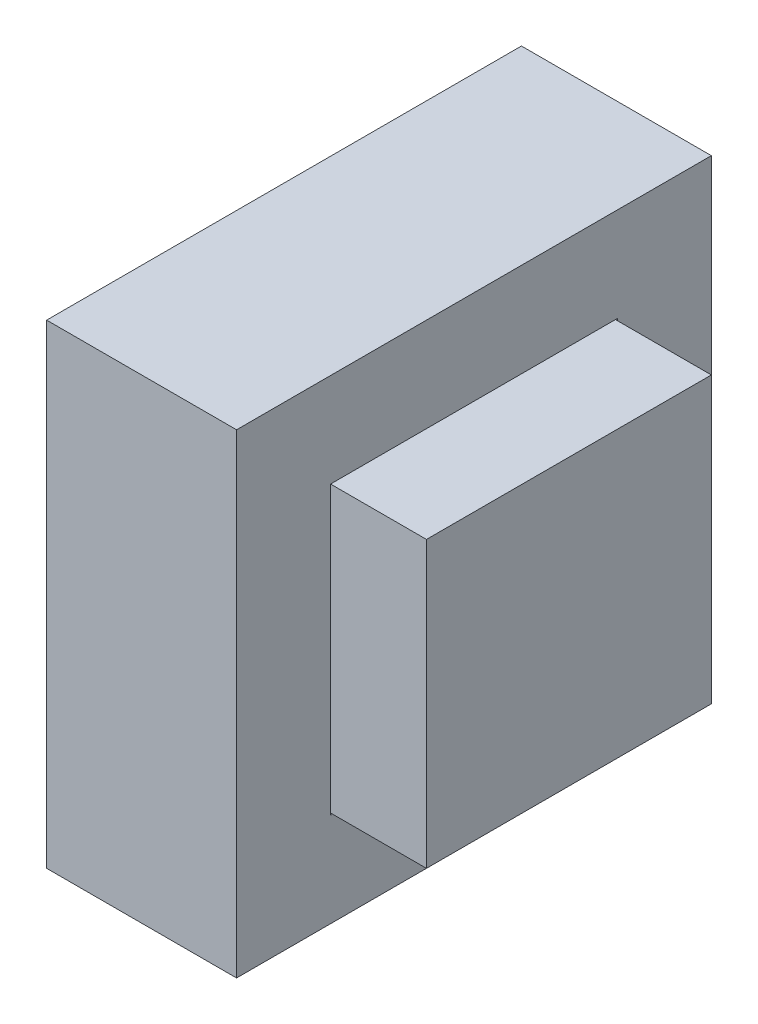
ISO-10303-21;
HEADER;
FILE_DESCRIPTION(('STEP AP214'),'2;1');
FILE_NAME('part.step','',(''),(''),'','','');
FILE_SCHEMA(('AUTOMOTIVE_DESIGN { 1 0 10303 214 1 1 1 1 }'));
ENDSEC;
DATA;
#1=APPLICATION_CONTEXT('core data for automotive mechanical design processes');
#2=APPLICATION_PROTOCOL_DEFINITION('international standard','automotive_design',2000,#1);
#3=PRODUCT_CONTEXT('',#1,'mechanical');
#4=PRODUCT('Part','Part','',(#3));
#5=PRODUCT_RELATED_PRODUCT_CATEGORY('part','',(#4));
#6=PRODUCT_DEFINITION_FORMATION('','',#4);
#7=PRODUCT_DEFINITION_CONTEXT('part definition',#1,'design');
#8=PRODUCT_DEFINITION('design','',#6,#7);
#9=PRODUCT_DEFINITION_SHAPE('','',#8);
#10=(LENGTH_UNIT() NAMED_UNIT(*) SI_UNIT(.MILLI.,.METRE.));
#11=(NAMED_UNIT(*) PLANE_ANGLE_UNIT() SI_UNIT($,.RADIAN.));
#12=(NAMED_UNIT(*) SI_UNIT($,.STERADIAN.) SOLID_ANGLE_UNIT());
#13=UNCERTAINTY_MEASURE_WITH_UNIT(LENGTH_MEASURE(1.E-05),#10,'distance_accuracy_value','');
#14=(GEOMETRIC_REPRESENTATION_CONTEXT(3) GLOBAL_UNCERTAINTY_ASSIGNED_CONTEXT((#13)) GLOBAL_UNIT_ASSIGNED_CONTEXT((#10,
#11,#12)) REPRESENTATION_CONTEXT('',''));
#15=CARTESIAN_POINT('',(0.,0.,0.));
#16=DIRECTION('',(0.,0.,1.));
#17=DIRECTION('',(1.,0.,0.));
#18=AXIS2_PLACEMENT_3D('',#15,#16,#17);
#19=CARTESIAN_POINT('',(20.,25.,-25.));
#20=DIRECTION('',(0.,0.,1.));
#21=DIRECTION('',(1.,0.,0.));
#22=AXIS2_PLACEMENT_3D('',#19,#20,#21);
#23=PLANE('',#22);
#24=DIRECTION('',(0.,1.,0.));
#25=VECTOR('',#24,1.);
#26=CARTESIAN_POINT('',(0.,25.,-25.));
#27=LINE('',#26,#25);
#28=CARTESIAN_POINT('',(0.,-25.,-25.));
#29=VERTEX_POINT('',#28);
#30=CARTESIAN_POINT('',(0.,25.,-25.));
#31=VERTEX_POINT('',#30);
#32=EDGE_CURVE('E202',#29,#31,#27,.T.);
#33=ORIENTED_EDGE('',*,*,#32,.T.);
#34=DIRECTION('',(-1.,0.,0.));
#35=VECTOR('',#34,1.);
#36=CARTESIAN_POINT('',(20.,25.,-25.));
#37=LINE('',#36,#35);
#38=CARTESIAN_POINT('',(20.,25.,-25.));
#39=VERTEX_POINT('',#38);
#40=EDGE_CURVE('E223',#39,#31,#37,.T.);
#41=ORIENTED_EDGE('',*,*,#40,.F.);
#42=DIRECTION('',(0.,1.,0.));
#43=VECTOR('',#42,1.);
#44=CARTESIAN_POINT('',(20.,25.,-25.));
#45=LINE('',#44,#43);
#46=CARTESIAN_POINT('',(20.,-25.,-25.));
#47=VERTEX_POINT('',#46);
#48=EDGE_CURVE('E203',#47,#39,#45,.T.);
#49=ORIENTED_EDGE('',*,*,#48,.F.);
#50=DIRECTION('',(-1.,0.,0.));
#51=VECTOR('',#50,1.);
#52=CARTESIAN_POINT('',(20.,-25.,-25.));
#53=LINE('',#52,#51);
#54=EDGE_CURVE('E209',#47,#29,#53,.T.);
#55=ORIENTED_EDGE('',*,*,#54,.T.);
#56=EDGE_LOOP('',(#33,#41,#49,#55));
#57=FACE_BOUND('',#56,.T.);
#58=ADVANCED_FACE('F40',(#57),#23,.F.);
#59=CARTESIAN_POINT('',(20.,25.,25.));
#60=DIRECTION('',(0.,-1.,0.));
#61=DIRECTION('',(0.,0.,-1.));
#62=AXIS2_PLACEMENT_3D('',#59,#60,#61);
#63=PLANE('',#62);
#64=DIRECTION('',(0.,0.,1.));
#65=VECTOR('',#64,1.);
#66=CARTESIAN_POINT('',(0.,25.,25.));
#67=LINE('',#66,#65);
#68=CARTESIAN_POINT('',(0.,25.,25.));
#69=VERTEX_POINT('',#68);
#70=EDGE_CURVE('E212',#31,#69,#67,.T.);
#71=ORIENTED_EDGE('',*,*,#70,.T.);
#72=DIRECTION('',(-1.,0.,0.));
#73=VECTOR('',#72,1.);
#74=CARTESIAN_POINT('',(20.,25.,25.));
#75=LINE('',#74,#73);
#76=CARTESIAN_POINT('',(20.,25.,25.));
#77=VERTEX_POINT('',#76);
#78=EDGE_CURVE('E220',#77,#69,#75,.T.);
#79=ORIENTED_EDGE('',*,*,#78,.F.);
#80=DIRECTION('',(0.,0.,1.));
#81=VECTOR('',#80,1.);
#82=CARTESIAN_POINT('',(20.,25.,25.));
#83=LINE('',#82,#81);
#84=EDGE_CURVE('E91',#39,#77,#83,.T.);
#85=ORIENTED_EDGE('',*,*,#84,.F.);
#86=ORIENTED_EDGE('',*,*,#40,.T.);
#87=EDGE_LOOP('',(#71,#79,#85,#86));
#88=FACE_BOUND('',#87,.T.);
#89=ADVANCED_FACE('F256',(#88),#63,.F.);
#90=CARTESIAN_POINT('',(20.,25.,25.));
#91=DIRECTION('',(0.,0.,-1.));
#92=DIRECTION('',(0.,1.,0.));
#93=AXIS2_PLACEMENT_3D('',#90,#91,#92);
#94=PLANE('',#93);
#95=DIRECTION('',(0.,-1.,0.));
#96=VECTOR('',#95,1.);
#97=CARTESIAN_POINT('',(0.,25.,25.));
#98=LINE('',#97,#96);
#99=CARTESIAN_POINT('',(0.,-25.,25.));
#100=VERTEX_POINT('',#99);
#101=EDGE_CURVE('E214',#69,#100,#98,.T.);
#102=ORIENTED_EDGE('',*,*,#101,.T.);
#103=DIRECTION('',(-1.,0.,0.));
#104=VECTOR('',#103,1.);
#105=CARTESIAN_POINT('',(20.,-25.,25.));
#106=LINE('',#105,#104);
#107=CARTESIAN_POINT('',(20.,-25.,25.));
#108=VERTEX_POINT('',#107);
#109=EDGE_CURVE('E218',#108,#100,#106,.T.);
#110=ORIENTED_EDGE('',*,*,#109,.F.);
#111=DIRECTION('',(0.,-1.,0.));
#112=VECTOR('',#111,1.);
#113=CARTESIAN_POINT('',(20.,25.,25.));
#114=LINE('',#113,#112);
#115=EDGE_CURVE('E206',#77,#108,#114,.T.);
#116=ORIENTED_EDGE('',*,*,#115,.F.);
#117=ORIENTED_EDGE('',*,*,#78,.T.);
#118=EDGE_LOOP('',(#102,#110,#116,#117));
#119=FACE_BOUND('',#118,.T.);
#120=ADVANCED_FACE('F261',(#119),#94,.F.);
#121=CARTESIAN_POINT('',(20.,-25.,25.));
#122=DIRECTION('',(0.,1.,0.));
#123=DIRECTION('',(0.,0.,1.));
#124=AXIS2_PLACEMENT_3D('',#121,#122,#123);
#125=PLANE('',#124);
#126=DIRECTION('',(0.,0.,-1.));
#127=VECTOR('',#126,1.);
#128=CARTESIAN_POINT('',(0.,-25.,25.));
#129=LINE('',#128,#127);
#130=EDGE_CURVE('E83',#100,#29,#129,.T.);
#131=ORIENTED_EDGE('',*,*,#130,.T.);
#132=ORIENTED_EDGE('',*,*,#54,.F.);
#133=DIRECTION('',(0.,0.,-1.));
#134=VECTOR('',#133,1.);
#135=CARTESIAN_POINT('',(20.,-25.,25.));
#136=LINE('',#135,#134);
#137=EDGE_CURVE('E62',#108,#47,#136,.T.);
#138=ORIENTED_EDGE('',*,*,#137,.F.);
#139=ORIENTED_EDGE('',*,*,#109,.T.);
#140=EDGE_LOOP('',(#131,#132,#138,#139));
#141=FACE_BOUND('',#140,.T.);
#142=ADVANCED_FACE('F272',(#141),#125,.F.);
#143=CARTESIAN_POINT('',(20.,0.,0.));
#144=DIRECTION('',(1.,0.,0.));
#145=DIRECTION('',(0.,0.,-1.));
#146=AXIS2_PLACEMENT_3D('',#143,#144,#145);
#147=PLANE('',#146);
#148=DIRECTION('',(0.,-1.,0.));
#149=VECTOR('',#148,1.);
#150=CARTESIAN_POINT('',(20.,0.,15.1));
#151=LINE('',#150,#149);
#152=CARTESIAN_POINT('',(20.,15.1,15.1));
#153=VERTEX_POINT('',#152);
#154=CARTESIAN_POINT('',(20.,-15.1,15.1));
#155=VERTEX_POINT('',#154);
#156=EDGE_CURVE('E11',#153,#155,#151,.T.);
#157=ORIENTED_EDGE('',*,*,#156,.F.);
#158=DIRECTION('',(0.,0.,1.));
#159=VECTOR('',#158,1.);
#160=CARTESIAN_POINT('',(20.,15.1,0.));
#161=LINE('',#160,#159);
#162=CARTESIAN_POINT('',(20.,15.1,-15.1));
#163=VERTEX_POINT('',#162);
#164=EDGE_CURVE('E47',#163,#153,#161,.T.);
#165=ORIENTED_EDGE('',*,*,#164,.F.);
#166=DIRECTION('',(0.,1.,0.));
#167=VECTOR('',#166,1.);
#168=CARTESIAN_POINT('',(20.,0.,-15.1));
#169=LINE('',#168,#167);
#170=CARTESIAN_POINT('',(20.,-15.1,-15.1));
#171=VERTEX_POINT('',#170);
#172=EDGE_CURVE('E227',#171,#163,#169,.T.);
#173=ORIENTED_EDGE('',*,*,#172,.F.);
#174=DIRECTION('',(0.,0.,-1.));
#175=VECTOR('',#174,1.);
#176=CARTESIAN_POINT('',(20.,-15.1,0.));
#177=LINE('',#176,#175);
#178=EDGE_CURVE('E225',#155,#171,#177,.T.);
#179=ORIENTED_EDGE('',*,*,#178,.F.);
#180=EDGE_LOOP('',(#157,#165,#173,#179));
#181=FACE_BOUND('',#180,.T.);
#182=ORIENTED_EDGE('',*,*,#48,.T.);
#183=ORIENTED_EDGE('',*,*,#84,.T.);
#184=ORIENTED_EDGE('',*,*,#115,.T.);
#185=ORIENTED_EDGE('',*,*,#137,.T.);
#186=EDGE_LOOP('',(#182,#183,#184,#185));
#187=FACE_BOUND('',#186,.T.);
#188=ADVANCED_FACE('F239',(#181,#187),#147,.T.);
#189=CARTESIAN_POINT('',(0.,0.,0.));
#190=DIRECTION('',(1.,0.,0.));
#191=DIRECTION('',(0.,0.,-1.));
#192=AXIS2_PLACEMENT_3D('',#189,#190,#191);
#193=PLANE('',#192);
#194=ORIENTED_EDGE('',*,*,#32,.F.);
#195=ORIENTED_EDGE('',*,*,#130,.F.);
#196=ORIENTED_EDGE('',*,*,#101,.F.);
#197=ORIENTED_EDGE('',*,*,#70,.F.);
#198=EDGE_LOOP('',(#194,#195,#196,#197));
#199=FACE_BOUND('',#198,.T.);
#200=ADVANCED_FACE('F266',(#199),#193,.F.);
#201=CARTESIAN_POINT('',(15.,15.1,15.1));
#202=DIRECTION('',(0.,0.,1.));
#203=DIRECTION('',(1.,0.,0.));
#204=AXIS2_PLACEMENT_3D('',#201,#202,#203);
#205=PLANE('',#204);
#206=ORIENTED_EDGE('',*,*,#156,.T.);
#207=DIRECTION('',(1.,0.,0.));
#208=VECTOR('',#207,1.);
#209=CARTESIAN_POINT('',(15.,-15.1,15.1));
#210=LINE('',#209,#208);
#211=CARTESIAN_POINT('',(15.,-15.1,15.1));
#212=VERTEX_POINT('',#211);
#213=EDGE_CURVE('E54',#212,#155,#210,.T.);
#214=ORIENTED_EDGE('',*,*,#213,.F.);
#215=DIRECTION('',(0.,-1.,0.));
#216=VECTOR('',#215,1.);
#217=CARTESIAN_POINT('',(15.,15.1,15.1));
#218=LINE('',#217,#216);
#219=CARTESIAN_POINT('',(15.,15.1,15.1));
#220=VERTEX_POINT('',#219);
#221=EDGE_CURVE('E169',#220,#212,#218,.T.);
#222=ORIENTED_EDGE('',*,*,#221,.F.);
#223=DIRECTION('',(1.,0.,0.));
#224=VECTOR('',#223,1.);
#225=CARTESIAN_POINT('',(15.,15.1,15.1));
#226=LINE('',#225,#224);
#227=EDGE_CURVE('E181',#220,#153,#226,.T.);
#228=ORIENTED_EDGE('',*,*,#227,.T.);
#229=EDGE_LOOP('',(#206,#214,#222,#228));
#230=FACE_BOUND('',#229,.T.);
#231=ADVANCED_FACE('F237',(#230),#205,.F.);
#232=CARTESIAN_POINT('',(15.,15.1,-15.1));
#233=DIRECTION('',(0.,1.,0.));
#234=DIRECTION('',(0.,0.,1.));
#235=AXIS2_PLACEMENT_3D('',#232,#233,#234);
#236=PLANE('',#235);
#237=ORIENTED_EDGE('',*,*,#164,.T.);
#238=ORIENTED_EDGE('',*,*,#227,.F.);
#239=DIRECTION('',(0.,0.,1.));
#240=VECTOR('',#239,1.);
#241=CARTESIAN_POINT('',(15.,15.1,-15.1));
#242=LINE('',#241,#240);
#243=CARTESIAN_POINT('',(15.,15.1,-15.1));
#244=VERTEX_POINT('',#243);
#245=EDGE_CURVE('E178',#244,#220,#242,.T.);
#246=ORIENTED_EDGE('',*,*,#245,.F.);
#247=DIRECTION('',(1.,0.,0.));
#248=VECTOR('',#247,1.);
#249=CARTESIAN_POINT('',(15.,15.1,-15.1));
#250=LINE('',#249,#248);
#251=EDGE_CURVE('E184',#244,#163,#250,.T.);
#252=ORIENTED_EDGE('',*,*,#251,.T.);
#253=EDGE_LOOP('',(#237,#238,#246,#252));
#254=FACE_BOUND('',#253,.T.);
#255=ADVANCED_FACE('F230',(#254),#236,.F.);
#256=CARTESIAN_POINT('',(15.,-15.1,-15.1));
#257=DIRECTION('',(0.,0.,-1.));
#258=DIRECTION('',(-1.,0.,0.));
#259=AXIS2_PLACEMENT_3D('',#256,#257,#258);
#260=PLANE('',#259);
#261=ORIENTED_EDGE('',*,*,#172,.T.);
#262=ORIENTED_EDGE('',*,*,#251,.F.);
#263=DIRECTION('',(0.,1.,0.));
#264=VECTOR('',#263,1.);
#265=CARTESIAN_POINT('',(15.,-15.1,-15.1));
#266=LINE('',#265,#264);
#267=CARTESIAN_POINT('',(15.,-15.1,-15.1));
#268=VERTEX_POINT('',#267);
#269=EDGE_CURVE('E175',#268,#244,#266,.T.);
#270=ORIENTED_EDGE('',*,*,#269,.F.);
#271=DIRECTION('',(1.,0.,0.));
#272=VECTOR('',#271,1.);
#273=CARTESIAN_POINT('',(15.,-15.1,-15.1));
#274=LINE('',#273,#272);
#275=EDGE_CURVE('E187',#268,#171,#274,.T.);
#276=ORIENTED_EDGE('',*,*,#275,.T.);
#277=EDGE_LOOP('',(#261,#262,#270,#276));
#278=FACE_BOUND('',#277,.T.);
#279=ADVANCED_FACE('F243',(#278),#260,.F.);
#280=CARTESIAN_POINT('',(15.,-15.1,15.1));
#281=DIRECTION('',(0.,-1.,0.));
#282=DIRECTION('',(0.,0.,-1.));
#283=AXIS2_PLACEMENT_3D('',#280,#281,#282);
#284=PLANE('',#283);
#285=ORIENTED_EDGE('',*,*,#178,.T.);
#286=ORIENTED_EDGE('',*,*,#275,.F.);
#287=DIRECTION('',(0.,0.,-1.));
#288=VECTOR('',#287,1.);
#289=CARTESIAN_POINT('',(15.,-15.1,15.1));
#290=LINE('',#289,#288);
#291=EDGE_CURVE('E172',#212,#268,#290,.T.);
#292=ORIENTED_EDGE('',*,*,#291,.F.);
#293=ORIENTED_EDGE('',*,*,#213,.T.);
#294=EDGE_LOOP('',(#285,#286,#292,#293));
#295=FACE_BOUND('',#294,.T.);
#296=ADVANCED_FACE('F240',(#295),#284,.F.);
#297=CARTESIAN_POINT('',(15.,0.,0.));
#298=DIRECTION('',(1.,0.,0.));
#299=DIRECTION('',(0.,0.,-1.));
#300=AXIS2_PLACEMENT_3D('',#297,#298,#299);
#301=PLANE('',#300);
#302=DIRECTION('',(0.,0.,1.));
#303=VECTOR('',#302,1.);
#304=CARTESIAN_POINT('',(15.,15.,-15.));
#305=LINE('',#304,#303);
#306=CARTESIAN_POINT('',(15.,15.,-15.));
#307=VERTEX_POINT('',#306);
#308=CARTESIAN_POINT('',(15.,15.,15.));
#309=VERTEX_POINT('',#308);
#310=EDGE_CURVE('E167',#307,#309,#305,.T.);
#311=ORIENTED_EDGE('',*,*,#310,.F.);
#312=DIRECTION('',(0.,1.,0.));
#313=VECTOR('',#312,1.);
#314=CARTESIAN_POINT('',(15.,-15.,-15.));
#315=LINE('',#314,#313);
#316=CARTESIAN_POINT('',(15.,-15.,-15.));
#317=VERTEX_POINT('',#316);
#318=EDGE_CURVE('E160',#317,#307,#315,.T.);
#319=ORIENTED_EDGE('',*,*,#318,.F.);
#320=DIRECTION('',(0.,0.,-1.));
#321=VECTOR('',#320,1.);
#322=CARTESIAN_POINT('',(15.,-15.,15.));
#323=LINE('',#322,#321);
#324=CARTESIAN_POINT('',(15.,-15.,15.));
#325=VERTEX_POINT('',#324);
#326=EDGE_CURVE('E142',#325,#317,#323,.T.);
#327=ORIENTED_EDGE('',*,*,#326,.F.);
#328=DIRECTION('',(0.,-1.,0.));
#329=VECTOR('',#328,1.);
#330=CARTESIAN_POINT('',(15.,15.,15.));
#331=LINE('',#330,#329);
#332=EDGE_CURVE('E157',#309,#325,#331,.T.);
#333=ORIENTED_EDGE('',*,*,#332,.F.);
#334=EDGE_LOOP('',(#311,#319,#327,#333));
#335=FACE_BOUND('',#334,.T.);
#336=ORIENTED_EDGE('',*,*,#221,.T.);
#337=ORIENTED_EDGE('',*,*,#291,.T.);
#338=ORIENTED_EDGE('',*,*,#269,.T.);
#339=ORIENTED_EDGE('',*,*,#245,.T.);
#340=EDGE_LOOP('',(#336,#337,#338,#339));
#341=FACE_BOUND('',#340,.T.);
#342=ADVANCED_FACE('F155',(#335,#341),#301,.T.);
#343=CARTESIAN_POINT('',(30.,0.,0.));
#344=DIRECTION('',(1.,0.,0.));
#345=DIRECTION('',(0.,0.,-1.));
#346=AXIS2_PLACEMENT_3D('',#343,#344,#345);
#347=PLANE('',#346);
#348=DIRECTION('',(0.,0.,-1.));
#349=VECTOR('',#348,1.);
#350=CARTESIAN_POINT('',(30.,-15.,15.));
#351=LINE('',#350,#349);
#352=CARTESIAN_POINT('',(30.,-15.,15.));
#353=VERTEX_POINT('',#352);
#354=CARTESIAN_POINT('',(30.,-15.,-15.));
#355=VERTEX_POINT('',#354);
#356=EDGE_CURVE('E144',#353,#355,#351,.T.);
#357=ORIENTED_EDGE('',*,*,#356,.T.);
#358=DIRECTION('',(0.,1.,0.));
#359=VECTOR('',#358,1.);
#360=CARTESIAN_POINT('',(30.,-15.,-15.));
#361=LINE('',#360,#359);
#362=CARTESIAN_POINT('',(30.,15.,-15.));
#363=VERTEX_POINT('',#362);
#364=EDGE_CURVE('E192',#355,#363,#361,.T.);
#365=ORIENTED_EDGE('',*,*,#364,.T.);
#366=DIRECTION('',(0.,0.,1.));
#367=VECTOR('',#366,1.);
#368=CARTESIAN_POINT('',(30.,15.,-15.));
#369=LINE('',#368,#367);
#370=CARTESIAN_POINT('',(30.,15.,15.));
#371=VERTEX_POINT('',#370);
#372=EDGE_CURVE('E194',#363,#371,#369,.T.);
#373=ORIENTED_EDGE('',*,*,#372,.T.);
#374=DIRECTION('',(0.,-1.,0.));
#375=VECTOR('',#374,1.);
#376=CARTESIAN_POINT('',(30.,15.,15.));
#377=LINE('',#376,#375);
#378=EDGE_CURVE('E149',#371,#353,#377,.T.);
#379=ORIENTED_EDGE('',*,*,#378,.T.);
#380=EDGE_LOOP('',(#357,#365,#373,#379));
#381=FACE_BOUND('',#380,.T.);
#382=ADVANCED_FACE('F245',(#381),#347,.T.);
#383=CARTESIAN_POINT('',(30.,-15.,15.));
#384=DIRECTION('',(0.,1.,0.));
#385=DIRECTION('',(0.,0.,1.));
#386=AXIS2_PLACEMENT_3D('',#383,#384,#385);
#387=PLANE('',#386);
#388=DIRECTION('',(-1.,0.,0.));
#389=VECTOR('',#388,1.);
#390=CARTESIAN_POINT('',(30.,-15.,15.));
#391=LINE('',#390,#389);
#392=EDGE_CURVE('E138',#353,#325,#391,.T.);
#393=ORIENTED_EDGE('',*,*,#392,.T.);
#394=ORIENTED_EDGE('',*,*,#326,.T.);
#395=DIRECTION('',(-1.,0.,0.));
#396=VECTOR('',#395,1.);
#397=CARTESIAN_POINT('',(30.,-15.,-15.));
#398=LINE('',#397,#396);
#399=EDGE_CURVE('E200',#355,#317,#398,.T.);
#400=ORIENTED_EDGE('',*,*,#399,.F.);
#401=ORIENTED_EDGE('',*,*,#356,.F.);
#402=EDGE_LOOP('',(#393,#394,#400,#401));
#403=FACE_BOUND('',#402,.T.);
#404=ADVANCED_FACE('F140',(#403),#387,.F.);
#405=CARTESIAN_POINT('',(30.,-15.,-15.));
#406=DIRECTION('',(0.,0.,1.));
#407=DIRECTION('',(1.,0.,0.));
#408=AXIS2_PLACEMENT_3D('',#405,#406,#407);
#409=PLANE('',#408);
#410=ORIENTED_EDGE('',*,*,#399,.T.);
#411=ORIENTED_EDGE('',*,*,#318,.T.);
#412=DIRECTION('',(-1.,0.,0.));
#413=VECTOR('',#412,1.);
#414=CARTESIAN_POINT('',(30.,15.,-15.));
#415=LINE('',#414,#413);
#416=EDGE_CURVE('E198',#363,#307,#415,.T.);
#417=ORIENTED_EDGE('',*,*,#416,.F.);
#418=ORIENTED_EDGE('',*,*,#364,.F.);
#419=EDGE_LOOP('',(#410,#411,#417,#418));
#420=FACE_BOUND('',#419,.T.);
#421=ADVANCED_FACE('F364',(#420),#409,.F.);
#422=CARTESIAN_POINT('',(30.,15.,-15.));
#423=DIRECTION('',(0.,-1.,0.));
#424=DIRECTION('',(0.,0.,-1.));
#425=AXIS2_PLACEMENT_3D('',#422,#423,#424);
#426=PLANE('',#425);
#427=ORIENTED_EDGE('',*,*,#416,.T.);
#428=ORIENTED_EDGE('',*,*,#310,.T.);
#429=DIRECTION('',(-1.,0.,0.));
#430=VECTOR('',#429,1.);
#431=CARTESIAN_POINT('',(30.,15.,15.));
#432=LINE('',#431,#430);
#433=EDGE_CURVE('E148',#371,#309,#432,.T.);
#434=ORIENTED_EDGE('',*,*,#433,.F.);
#435=ORIENTED_EDGE('',*,*,#372,.F.);
#436=EDGE_LOOP('',(#427,#428,#434,#435));
#437=FACE_BOUND('',#436,.T.);
#438=ADVANCED_FACE('F374',(#437),#426,.F.);
#439=CARTESIAN_POINT('',(30.,15.,15.));
#440=DIRECTION('',(0.,0.,-1.));
#441=DIRECTION('',(-1.,0.,0.));
#442=AXIS2_PLACEMENT_3D('',#439,#440,#441);
#443=PLANE('',#442);
#444=ORIENTED_EDGE('',*,*,#433,.T.);
#445=ORIENTED_EDGE('',*,*,#332,.T.);
#446=ORIENTED_EDGE('',*,*,#392,.F.);
#447=ORIENTED_EDGE('',*,*,#378,.F.);
#448=EDGE_LOOP('',(#444,#445,#446,#447));
#449=FACE_BOUND('',#448,.T.);
#450=ADVANCED_FACE('F162',(#449),#443,.F.);
#451=CLOSED_SHELL('',(#58,#89,#120,#142,#188,#200,#231,#255,#279,#296,#342,#382,#404,#421,#438,#450));
#452=MANIFOLD_SOLID_BREP('B2',#451);
#453=ADVANCED_BREP_SHAPE_REPRESENTATION('',(#18,#452),#14);
#454=SHAPE_DEFINITION_REPRESENTATION(#9,#453);
ENDSEC;
END-ISO-10303-21;
